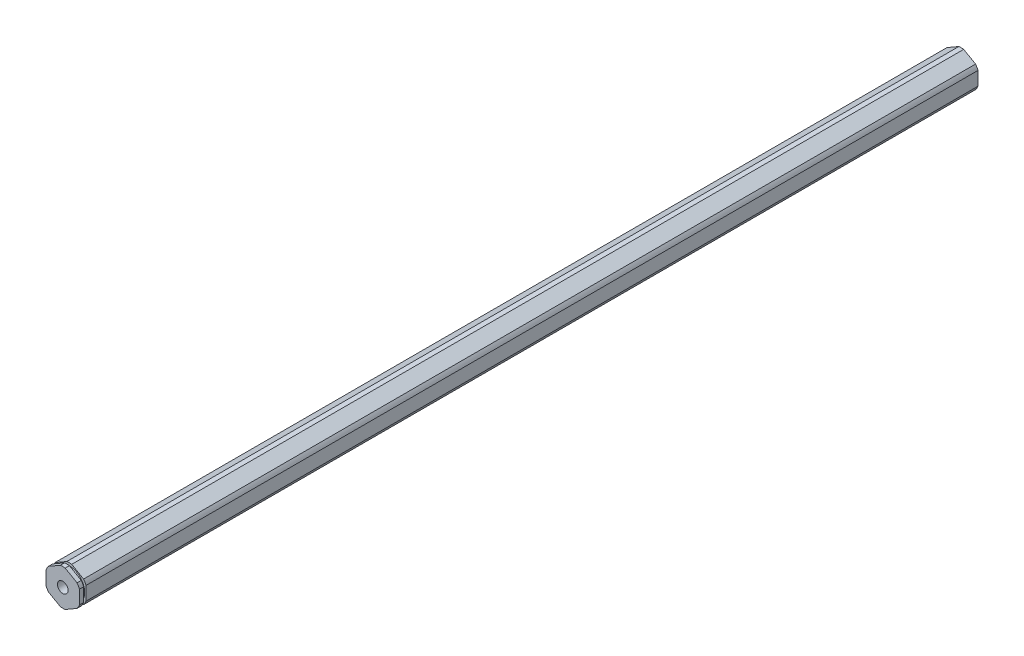
ISO-10303-21;
HEADER;
FILE_DESCRIPTION(('STEP AP214'),'2;1');
FILE_NAME('part.step','',(''),(''),'','','');
FILE_SCHEMA(('AUTOMOTIVE_DESIGN { 1 0 10303 214 1 1 1 1 }'));
ENDSEC;
DATA;
#1=APPLICATION_CONTEXT('core data for automotive mechanical design processes');
#2=APPLICATION_PROTOCOL_DEFINITION('international standard','automotive_design',2000,#1);
#3=PRODUCT_CONTEXT('',#1,'mechanical');
#4=PRODUCT('Part','Part','',(#3));
#5=PRODUCT_RELATED_PRODUCT_CATEGORY('part','',(#4));
#6=PRODUCT_DEFINITION_FORMATION('','',#4);
#7=PRODUCT_DEFINITION_CONTEXT('part definition',#1,'design');
#8=PRODUCT_DEFINITION('design','',#6,#7);
#9=PRODUCT_DEFINITION_SHAPE('','',#8);
#10=(LENGTH_UNIT() NAMED_UNIT(*) SI_UNIT(.MILLI.,.METRE.));
#11=(NAMED_UNIT(*) PLANE_ANGLE_UNIT() SI_UNIT($,.RADIAN.));
#12=(NAMED_UNIT(*) SI_UNIT($,.STERADIAN.) SOLID_ANGLE_UNIT());
#13=UNCERTAINTY_MEASURE_WITH_UNIT(LENGTH_MEASURE(1.E-05),#10,'distance_accuracy_value','');
#14=(GEOMETRIC_REPRESENTATION_CONTEXT(3) GLOBAL_UNCERTAINTY_ASSIGNED_CONTEXT((#13)) GLOBAL_UNIT_ASSIGNED_CONTEXT((#10,
#11,#12)) REPRESENTATION_CONTEXT('',''));
#15=CARTESIAN_POINT('',(0.,0.,0.));
#16=DIRECTION('',(0.,0.,1.));
#17=DIRECTION('',(1.,0.,0.));
#18=AXIS2_PLACEMENT_3D('',#15,#16,#17);
#19=CARTESIAN_POINT('',(6.35,0.,170.307));
#20=DIRECTION('',(-1.,0.,0.));
#21=DIRECTION('',(0.,-1.,0.));
#22=AXIS2_PLACEMENT_3D('',#19,#20,#21);
#23=PLANE('',#22);
#24=DIRECTION('',(0.,-1.,0.));
#25=VECTOR('',#24,1.);
#26=CARTESIAN_POINT('',(6.35,0.,168.7195));
#27=LINE('',#26,#25);
#28=CARTESIAN_POINT('',(6.35,2.59030191290513,168.7195));
#29=VERTEX_POINT('',#28);
#30=CARTESIAN_POINT('',(6.35,-2.59030191290513,168.7195));
#31=VERTEX_POINT('',#30);
#32=EDGE_CURVE('E80',#29,#31,#27,.T.);
#33=ORIENTED_EDGE('',*,*,#32,.F.);
#34=DIRECTION('',(0.,0.,-1.));
#35=VECTOR('',#34,1.);
#36=CARTESIAN_POINT('',(6.35,2.59030191290513,170.307));
#37=LINE('',#36,#35);
#38=CARTESIAN_POINT('',(6.35,2.59030191290513,170.307));
#39=VERTEX_POINT('',#38);
#40=EDGE_CURVE('E251',#39,#29,#37,.T.);
#41=ORIENTED_EDGE('',*,*,#40,.F.);
#42=DIRECTION('',(0.,1.,0.));
#43=VECTOR('',#42,1.);
#44=CARTESIAN_POINT('',(6.35,0.,170.307));
#45=LINE('',#44,#43);
#46=CARTESIAN_POINT('',(6.35,-2.59030191290513,170.307));
#47=VERTEX_POINT('',#46);
#48=EDGE_CURVE('E365',#47,#39,#45,.T.);
#49=ORIENTED_EDGE('',*,*,#48,.F.);
#50=DIRECTION('',(0.,0.,-1.));
#51=VECTOR('',#50,1.);
#52=CARTESIAN_POINT('',(6.35,-2.59030191290513,170.307));
#53=LINE('',#52,#51);
#54=EDGE_CURVE('E306',#47,#31,#53,.T.);
#55=ORIENTED_EDGE('',*,*,#54,.T.);
#56=EDGE_LOOP('',(#33,#41,#49,#55));
#57=FACE_BOUND('',#56,.T.);
#58=ADVANCED_FACE('F58',(#57),#23,.F.);
#59=CARTESIAN_POINT('',(0.,0.,170.307));
#60=DIRECTION('',(0.,0.,-1.));
#61=DIRECTION('',(-1.,0.,0.));
#62=AXIS2_PLACEMENT_3D('',#59,#60,#61);
#63=CYLINDRICAL_SURFACE('',#62,6.858);
#64=CARTESIAN_POINT('',(0.,0.,168.7195));
#65=DIRECTION('',(0.,0.,1.));
#66=DIRECTION('',(1.,0.,0.));
#67=AXIS2_PLACEMENT_3D('',#64,#65,#66);
#68=CIRCLE('',#67,6.858);
#69=CARTESIAN_POINT('',(5.41826726004727,4.20411035757862,168.7195));
#70=VERTEX_POINT('',#69);
#71=EDGE_CURVE('E420',#29,#70,#68,.T.);
#72=ORIENTED_EDGE('',*,*,#71,.T.);
#73=DIRECTION('',(0.,0.,-1.));
#74=VECTOR('',#73,1.);
#75=CARTESIAN_POINT('',(5.41826726004727,4.20411035757862,170.307));
#76=LINE('',#75,#74);
#77=CARTESIAN_POINT('',(5.41826726004727,4.20411035757862,170.307));
#78=VERTEX_POINT('',#77);
#79=EDGE_CURVE('E252',#78,#70,#76,.T.);
#80=ORIENTED_EDGE('',*,*,#79,.F.);
#81=CARTESIAN_POINT('',(0.,0.,170.307));
#82=DIRECTION('',(0.,0.,1.));
#83=DIRECTION('',(1.,0.,0.));
#84=AXIS2_PLACEMENT_3D('',#81,#82,#83);
#85=CIRCLE('',#84,6.858);
#86=EDGE_CURVE('E362',#39,#78,#85,.T.);
#87=ORIENTED_EDGE('',*,*,#86,.F.);
#88=ORIENTED_EDGE('',*,*,#40,.T.);
#89=EDGE_LOOP('',(#72,#80,#87,#88));
#90=FACE_BOUND('',#89,.T.);
#91=ADVANCED_FACE('F550',(#90),#63,.T.);
#92=CARTESIAN_POINT('',(3.175,5.49926131403119,170.307));
#93=DIRECTION('',(-0.5,-0.866025403784439,0.));
#94=DIRECTION('',(0.866025403784439,-0.5,0.));
#95=AXIS2_PLACEMENT_3D('',#92,#93,#94);
#96=PLANE('',#95);
#97=DIRECTION('',(0.866025403784439,-0.5,0.));
#98=VECTOR('',#97,1.);
#99=CARTESIAN_POINT('',(3.175,5.49926131403119,168.7195));
#100=LINE('',#99,#98);
#101=CARTESIAN_POINT('',(0.931732739952733,6.79441227048375,168.7195));
#102=VERTEX_POINT('',#101);
#103=EDGE_CURVE('E386',#102,#70,#100,.T.);
#104=ORIENTED_EDGE('',*,*,#103,.F.);
#105=DIRECTION('',(0.,0.,-1.));
#106=VECTOR('',#105,1.);
#107=CARTESIAN_POINT('',(0.931732739952733,6.79441227048375,170.307));
#108=LINE('',#107,#106);
#109=CARTESIAN_POINT('',(0.931732739952733,6.79441227048375,170.307));
#110=VERTEX_POINT('',#109);
#111=EDGE_CURVE('E261',#110,#102,#108,.T.);
#112=ORIENTED_EDGE('',*,*,#111,.F.);
#113=DIRECTION('',(-0.866025403784439,0.5,0.));
#114=VECTOR('',#113,1.);
#115=CARTESIAN_POINT('',(3.175,5.49926131403119,170.307));
#116=LINE('',#115,#114);
#117=EDGE_CURVE('E359',#78,#110,#116,.T.);
#118=ORIENTED_EDGE('',*,*,#117,.F.);
#119=ORIENTED_EDGE('',*,*,#79,.T.);
#120=EDGE_LOOP('',(#104,#112,#118,#119));
#121=FACE_BOUND('',#120,.T.);
#122=ADVANCED_FACE('F562',(#121),#96,.F.);
#123=CARTESIAN_POINT('',(-0.931732739952722,6.79441227048375,168.7195));
#124=VERTEX_POINT('',#123);
#125=EDGE_CURVE('E423',#102,#124,#68,.T.);
#126=ORIENTED_EDGE('',*,*,#125,.T.);
#127=DIRECTION('',(0.,0.,-1.));
#128=VECTOR('',#127,1.);
#129=CARTESIAN_POINT('',(-0.931732739952731,6.79441227048375,170.307));
#130=LINE('',#129,#128);
#131=CARTESIAN_POINT('',(-0.931732739952731,6.79441227048375,170.307));
#132=VERTEX_POINT('',#131);
#133=EDGE_CURVE('E266',#132,#124,#130,.T.);
#134=ORIENTED_EDGE('',*,*,#133,.F.);
#135=EDGE_CURVE('E358',#110,#132,#85,.T.);
#136=ORIENTED_EDGE('',*,*,#135,.F.);
#137=ORIENTED_EDGE('',*,*,#111,.T.);
#138=EDGE_LOOP('',(#126,#134,#136,#137));
#139=FACE_BOUND('',#138,.T.);
#140=ADVANCED_FACE('F567',(#139),#63,.T.);
#141=CARTESIAN_POINT('',(-3.175,5.49926131403119,170.307));
#142=DIRECTION('',(0.5,-0.866025403784438,0.));
#143=DIRECTION('',(0.866025403784439,0.5,0.));
#144=AXIS2_PLACEMENT_3D('',#141,#142,#143);
#145=PLANE('',#144);
#146=DIRECTION('',(0.866025403784439,0.5,0.));
#147=VECTOR('',#146,1.);
#148=CARTESIAN_POINT('',(-3.175,5.49926131403119,168.7195));
#149=LINE('',#148,#147);
#150=CARTESIAN_POINT('',(-5.41826726004727,4.20411035757862,168.7195));
#151=VERTEX_POINT('',#150);
#152=EDGE_CURVE('E389',#151,#124,#149,.T.);
#153=ORIENTED_EDGE('',*,*,#152,.F.);
#154=DIRECTION('',(0.,0.,-1.));
#155=VECTOR('',#154,1.);
#156=CARTESIAN_POINT('',(-5.41826726004727,4.20411035757862,170.307));
#157=LINE('',#156,#155);
#158=CARTESIAN_POINT('',(-5.41826726004727,4.20411035757862,170.307));
#159=VERTEX_POINT('',#158);
#160=EDGE_CURVE('E271',#159,#151,#157,.T.);
#161=ORIENTED_EDGE('',*,*,#160,.F.);
#162=DIRECTION('',(-0.866025403784439,-0.5,0.));
#163=VECTOR('',#162,1.);
#164=CARTESIAN_POINT('',(-3.175,5.49926131403119,170.307));
#165=LINE('',#164,#163);
#166=EDGE_CURVE('E355',#132,#159,#165,.T.);
#167=ORIENTED_EDGE('',*,*,#166,.F.);
#168=ORIENTED_EDGE('',*,*,#133,.T.);
#169=EDGE_LOOP('',(#153,#161,#167,#168));
#170=FACE_BOUND('',#169,.T.);
#171=ADVANCED_FACE('F572',(#170),#145,.F.);
#172=CARTESIAN_POINT('',(-6.35,2.59030191290514,168.7195));
#173=VERTEX_POINT('',#172);
#174=EDGE_CURVE('E431',#151,#173,#68,.T.);
#175=ORIENTED_EDGE('',*,*,#174,.T.);
#176=DIRECTION('',(0.,0.,-1.));
#177=VECTOR('',#176,1.);
#178=CARTESIAN_POINT('',(-6.35,2.59030191290514,170.307));
#179=LINE('',#178,#177);
#180=CARTESIAN_POINT('',(-6.35,2.59030191290514,170.307));
#181=VERTEX_POINT('',#180);
#182=EDGE_CURVE('E276',#181,#173,#179,.T.);
#183=ORIENTED_EDGE('',*,*,#182,.F.);
#184=EDGE_CURVE('E354',#159,#181,#85,.T.);
#185=ORIENTED_EDGE('',*,*,#184,.F.);
#186=ORIENTED_EDGE('',*,*,#160,.T.);
#187=EDGE_LOOP('',(#175,#183,#185,#186));
#188=FACE_BOUND('',#187,.T.);
#189=ADVANCED_FACE('F445',(#188),#63,.T.);
#190=CARTESIAN_POINT('',(-6.35,0.,170.307));
#191=DIRECTION('',(1.,0.,0.));
#192=DIRECTION('',(0.,1.,0.));
#193=AXIS2_PLACEMENT_3D('',#190,#191,#192);
#194=PLANE('',#193);
#195=DIRECTION('',(0.,1.,0.));
#196=VECTOR('',#195,1.);
#197=CARTESIAN_POINT('',(-6.35,0.,168.7195));
#198=LINE('',#197,#196);
#199=CARTESIAN_POINT('',(-6.35,-2.59030191290514,168.7195));
#200=VERTEX_POINT('',#199);
#201=EDGE_CURVE('E392',#200,#173,#198,.T.);
#202=ORIENTED_EDGE('',*,*,#201,.F.);
#203=DIRECTION('',(0.,0.,-1.));
#204=VECTOR('',#203,1.);
#205=CARTESIAN_POINT('',(-6.35,-2.59030191290514,170.307));
#206=LINE('',#205,#204);
#207=CARTESIAN_POINT('',(-6.35,-2.59030191290514,170.307));
#208=VERTEX_POINT('',#207);
#209=EDGE_CURVE('E281',#208,#200,#206,.T.);
#210=ORIENTED_EDGE('',*,*,#209,.F.);
#211=DIRECTION('',(0.,-1.,0.));
#212=VECTOR('',#211,1.);
#213=CARTESIAN_POINT('',(-6.35,0.,170.307));
#214=LINE('',#213,#212);
#215=EDGE_CURVE('E351',#181,#208,#214,.T.);
#216=ORIENTED_EDGE('',*,*,#215,.F.);
#217=ORIENTED_EDGE('',*,*,#182,.T.);
#218=EDGE_LOOP('',(#202,#210,#216,#217));
#219=FACE_BOUND('',#218,.T.);
#220=ADVANCED_FACE('F452',(#219),#194,.F.);
#221=CARTESIAN_POINT('',(-5.41826726004727,-4.20411035757862,168.7195));
#222=VERTEX_POINT('',#221);
#223=EDGE_CURVE('E434',#200,#222,#68,.T.);
#224=ORIENTED_EDGE('',*,*,#223,.T.);
#225=DIRECTION('',(0.,0.,-1.));
#226=VECTOR('',#225,1.);
#227=CARTESIAN_POINT('',(-5.41826726004728,-4.20411035757862,170.307));
#228=LINE('',#227,#226);
#229=CARTESIAN_POINT('',(-5.41826726004728,-4.20411035757862,170.307));
#230=VERTEX_POINT('',#229);
#231=EDGE_CURVE('E286',#230,#222,#228,.T.);
#232=ORIENTED_EDGE('',*,*,#231,.F.);
#233=EDGE_CURVE('E350',#208,#230,#85,.T.);
#234=ORIENTED_EDGE('',*,*,#233,.F.);
#235=ORIENTED_EDGE('',*,*,#209,.T.);
#236=EDGE_LOOP('',(#224,#232,#234,#235));
#237=FACE_BOUND('',#236,.T.);
#238=ADVANCED_FACE('F541',(#237),#63,.T.);
#239=CARTESIAN_POINT('',(-3.175,-5.49926131403118,170.307));
#240=DIRECTION('',(0.5,0.866025403784439,0.));
#241=DIRECTION('',(-0.866025403784439,0.5,0.));
#242=AXIS2_PLACEMENT_3D('',#239,#240,#241);
#243=PLANE('',#242);
#244=DIRECTION('',(-0.866025403784439,0.5,0.));
#245=VECTOR('',#244,1.);
#246=CARTESIAN_POINT('',(-3.175,-5.49926131403118,168.7195));
#247=LINE('',#246,#245);
#248=CARTESIAN_POINT('',(-0.931732739952721,-6.79441227048375,168.7195));
#249=VERTEX_POINT('',#248);
#250=EDGE_CURVE('E395',#249,#222,#247,.T.);
#251=ORIENTED_EDGE('',*,*,#250,.F.);
#252=DIRECTION('',(0.,0.,-1.));
#253=VECTOR('',#252,1.);
#254=CARTESIAN_POINT('',(-0.931732739952721,-6.79441227048375,170.307));
#255=LINE('',#254,#253);
#256=CARTESIAN_POINT('',(-0.931732739952721,-6.79441227048375,170.307));
#257=VERTEX_POINT('',#256);
#258=EDGE_CURVE('E291',#257,#249,#255,.T.);
#259=ORIENTED_EDGE('',*,*,#258,.F.);
#260=DIRECTION('',(0.866025403784439,-0.5,0.));
#261=VECTOR('',#260,1.);
#262=CARTESIAN_POINT('',(-3.175,-5.49926131403118,170.307));
#263=LINE('',#262,#261);
#264=EDGE_CURVE('E347',#230,#257,#263,.T.);
#265=ORIENTED_EDGE('',*,*,#264,.F.);
#266=ORIENTED_EDGE('',*,*,#231,.T.);
#267=EDGE_LOOP('',(#251,#259,#265,#266));
#268=FACE_BOUND('',#267,.T.);
#269=ADVANCED_FACE('F549',(#268),#243,.F.);
#270=CARTESIAN_POINT('',(0.931732739952722,-6.79441227048375,168.7195));
#271=VERTEX_POINT('',#270);
#272=EDGE_CURVE('E424',#249,#271,#68,.T.);
#273=ORIENTED_EDGE('',*,*,#272,.T.);
#274=DIRECTION('',(0.,0.,-1.));
#275=VECTOR('',#274,1.);
#276=CARTESIAN_POINT('',(0.931732739952731,-6.79441227048375,170.307));
#277=LINE('',#276,#275);
#278=CARTESIAN_POINT('',(0.931732739952731,-6.79441227048375,170.307));
#279=VERTEX_POINT('',#278);
#280=EDGE_CURVE('E296',#279,#271,#277,.T.);
#281=ORIENTED_EDGE('',*,*,#280,.F.);
#282=EDGE_CURVE('E346',#257,#279,#85,.T.);
#283=ORIENTED_EDGE('',*,*,#282,.F.);
#284=ORIENTED_EDGE('',*,*,#258,.T.);
#285=EDGE_LOOP('',(#273,#281,#283,#284));
#286=FACE_BOUND('',#285,.T.);
#287=ADVANCED_FACE('F540',(#286),#63,.T.);
#288=CARTESIAN_POINT('',(3.175,-5.49926131403118,170.307));
#289=DIRECTION('',(-0.5,0.866025403784438,0.));
#290=DIRECTION('',(-0.866025403784439,-0.5,0.));
#291=AXIS2_PLACEMENT_3D('',#288,#289,#290);
#292=PLANE('',#291);
#293=DIRECTION('',(-0.866025403784439,-0.5,0.));
#294=VECTOR('',#293,1.);
#295=CARTESIAN_POINT('',(3.175,-5.49926131403118,168.7195));
#296=LINE('',#295,#294);
#297=CARTESIAN_POINT('',(5.41826726004727,-4.20411035757862,168.7195));
#298=VERTEX_POINT('',#297);
#299=EDGE_CURVE('E231',#298,#271,#296,.T.);
#300=ORIENTED_EDGE('',*,*,#299,.F.);
#301=DIRECTION('',(0.,0.,-1.));
#302=VECTOR('',#301,1.);
#303=CARTESIAN_POINT('',(5.41826726004727,-4.20411035757862,170.307));
#304=LINE('',#303,#302);
#305=CARTESIAN_POINT('',(5.41826726004727,-4.20411035757862,170.307));
#306=VERTEX_POINT('',#305);
#307=EDGE_CURVE('E301',#306,#298,#304,.T.);
#308=ORIENTED_EDGE('',*,*,#307,.F.);
#309=DIRECTION('',(0.866025403784439,0.5,0.));
#310=VECTOR('',#309,1.);
#311=CARTESIAN_POINT('',(3.175,-5.49926131403118,170.307));
#312=LINE('',#311,#310);
#313=EDGE_CURVE('E342',#279,#306,#312,.T.);
#314=ORIENTED_EDGE('',*,*,#313,.F.);
#315=ORIENTED_EDGE('',*,*,#280,.T.);
#316=EDGE_LOOP('',(#300,#308,#314,#315));
#317=FACE_BOUND('',#316,.T.);
#318=ADVANCED_FACE('F554',(#317),#292,.F.);
#319=CARTESIAN_POINT('',(0.,0.,168.7195));
#320=DIRECTION('',(0.,0.,-1.));
#321=DIRECTION('',(-1.,0.,0.));
#322=AXIS2_PLACEMENT_3D('',#319,#320,#321);
#323=CIRCLE('',#322,6.858);
#324=EDGE_CURVE('E11',#31,#298,#323,.T.);
#325=ORIENTED_EDGE('',*,*,#324,.F.);
#326=ORIENTED_EDGE('',*,*,#54,.F.);
#327=EDGE_CURVE('E345',#306,#47,#85,.T.);
#328=ORIENTED_EDGE('',*,*,#327,.F.);
#329=ORIENTED_EDGE('',*,*,#307,.T.);
#330=EDGE_LOOP('',(#325,#326,#328,#329));
#331=FACE_BOUND('',#330,.T.);
#332=ADVANCED_FACE('F683',(#331),#63,.T.);
#333=CARTESIAN_POINT('',(0.,0.,170.307));
#334=DIRECTION('',(0.,0.,1.));
#335=DIRECTION('',(1.,0.,0.));
#336=AXIS2_PLACEMENT_3D('',#333,#334,#335);
#337=PLANE('',#336);
#338=CARTESIAN_POINT('',(0.,0.,170.307));
#339=DIRECTION('',(0.,0.,1.));
#340=DIRECTION('',(1.,0.,0.));
#341=AXIS2_PLACEMENT_3D('',#338,#339,#340);
#342=CIRCLE('',#341,2.01929999999999);
#343=CARTESIAN_POINT('',(2.01929999999999,0.,170.307));
#344=VERTEX_POINT('',#343);
#345=EDGE_CURVE('E380',#344,#344,#342,.T.);
#346=ORIENTED_EDGE('',*,*,#345,.F.);
#347=EDGE_LOOP('',(#346));
#348=FACE_BOUND('',#347,.T.);
#349=ORIENTED_EDGE('',*,*,#48,.T.);
#350=ORIENTED_EDGE('',*,*,#86,.T.);
#351=ORIENTED_EDGE('',*,*,#117,.T.);
#352=ORIENTED_EDGE('',*,*,#135,.T.);
#353=ORIENTED_EDGE('',*,*,#166,.T.);
#354=ORIENTED_EDGE('',*,*,#184,.T.);
#355=ORIENTED_EDGE('',*,*,#215,.T.);
#356=ORIENTED_EDGE('',*,*,#233,.T.);
#357=ORIENTED_EDGE('',*,*,#264,.T.);
#358=ORIENTED_EDGE('',*,*,#282,.T.);
#359=ORIENTED_EDGE('',*,*,#313,.T.);
#360=ORIENTED_EDGE('',*,*,#327,.T.);
#361=EDGE_LOOP('',(#349,#350,#351,#352,#353,#354,#355,#356,#357,#358,#359,#360));
#362=FACE_BOUND('',#361,.T.);
#363=ADVANCED_FACE('F456',(#348,#362),#337,.T.);
#364=CARTESIAN_POINT('',(0.,0.,153.95956));
#365=DIRECTION('',(0.,0.,1.));
#366=DIRECTION('',(1.,0.,0.));
#367=AXIS2_PLACEMENT_3D('',#364,#365,#366);
#368=CONICAL_SURFACE('',#367,2.01929999999999,1.02974425867665);
#369=CARTESIAN_POINT('',(0.,0.,152.746242151998));
#370=VERTEX_POINT('',#369);
#371=VERTEX_LOOP('',#370);
#372=FACE_BOUND('',#371,.T.);
#373=CARTESIAN_POINT('',(0.,0.,153.95956));
#374=DIRECTION('',(0.,0.,1.));
#375=DIRECTION('',(1.,0.,0.));
#376=AXIS2_PLACEMENT_3D('',#373,#374,#375);
#377=CIRCLE('',#376,2.01929999999999);
#378=CARTESIAN_POINT('',(2.01929999999999,0.,153.95956));
#379=VERTEX_POINT('',#378);
#380=EDGE_CURVE('E376',#379,#379,#377,.T.);
#381=ORIENTED_EDGE('',*,*,#380,.T.);
#382=EDGE_LOOP('',(#381));
#383=FACE_BOUND('',#382,.T.);
#384=ADVANCED_FACE('F767',(#372,#383),#368,.F.);
#385=CARTESIAN_POINT('',(0.,0.,170.307));
#386=DIRECTION('',(0.,0.,1.));
#387=DIRECTION('',(1.,0.,0.));
#388=AXIS2_PLACEMENT_3D('',#385,#386,#387);
#389=CYLINDRICAL_SURFACE('',#388,2.01929999999999);
#390=ORIENTED_EDGE('',*,*,#380,.F.);
#391=EDGE_LOOP('',(#390));
#392=FACE_BOUND('',#391,.T.);
#393=ORIENTED_EDGE('',*,*,#345,.T.);
#394=EDGE_LOOP('',(#393));
#395=FACE_BOUND('',#394,.T.);
#396=ADVANCED_FACE('F655',(#392,#395),#389,.F.);
#397=CARTESIAN_POINT('',(0.,6.858,168.7195));
#398=DIRECTION('',(0.,0.,-1.));
#399=DIRECTION('',(-1.,0.,0.));
#400=AXIS2_PLACEMENT_3D('',#397,#398,#399);
#401=PLANE('',#400);
#402=CARTESIAN_POINT('',(0.,0.,168.7195));
#403=DIRECTION('',(0.,0.,1.));
#404=DIRECTION('',(1.,0.,0.));
#405=AXIS2_PLACEMENT_3D('',#402,#403,#404);
#406=CIRCLE('',#405,5.8547);
#407=CARTESIAN_POINT('',(5.8547,0.,168.7195));
#408=VERTEX_POINT('',#407);
#409=EDGE_CURVE('E413',#408,#408,#406,.T.);
#410=ORIENTED_EDGE('',*,*,#409,.T.);
#411=EDGE_LOOP('',(#410));
#412=FACE_BOUND('',#411,.T.);
#413=ORIENTED_EDGE('',*,*,#32,.T.);
#414=ORIENTED_EDGE('',*,*,#324,.T.);
#415=ORIENTED_EDGE('',*,*,#299,.T.);
#416=ORIENTED_EDGE('',*,*,#272,.F.);
#417=ORIENTED_EDGE('',*,*,#250,.T.);
#418=ORIENTED_EDGE('',*,*,#223,.F.);
#419=ORIENTED_EDGE('',*,*,#201,.T.);
#420=ORIENTED_EDGE('',*,*,#174,.F.);
#421=ORIENTED_EDGE('',*,*,#152,.T.);
#422=ORIENTED_EDGE('',*,*,#125,.F.);
#423=ORIENTED_EDGE('',*,*,#103,.T.);
#424=ORIENTED_EDGE('',*,*,#71,.F.);
#425=EDGE_LOOP('',(#413,#414,#415,#416,#417,#418,#419,#420,#421,#422,#423,#424));
#426=FACE_BOUND('',#425,.T.);
#427=ADVANCED_FACE('F651',(#412,#426),#401,.T.);
#428=CARTESIAN_POINT('',(0.,6.858,167.8305));
#429=DIRECTION('',(0.,0.,1.));
#430=DIRECTION('',(1.,0.,0.));
#431=AXIS2_PLACEMENT_3D('',#428,#429,#430);
#432=PLANE('',#431);
#433=CARTESIAN_POINT('',(0.,0.,167.8305));
#434=DIRECTION('',(0.,0.,1.));
#435=DIRECTION('',(1.,0.,0.));
#436=AXIS2_PLACEMENT_3D('',#433,#434,#435);
#437=CIRCLE('',#436,5.8547);
#438=CARTESIAN_POINT('',(5.8547,0.,167.8305));
#439=VERTEX_POINT('',#438);
#440=EDGE_CURVE('E242',#439,#439,#437,.T.);
#441=ORIENTED_EDGE('',*,*,#440,.F.);
#442=EDGE_LOOP('',(#441));
#443=FACE_BOUND('',#442,.T.);
#444=DIRECTION('',(0.,1.,0.));
#445=VECTOR('',#444,1.);
#446=CARTESIAN_POINT('',(6.35,0.,167.8305));
#447=LINE('',#446,#445);
#448=CARTESIAN_POINT('',(6.35,-2.59030191290513,167.8305));
#449=VERTEX_POINT('',#448);
#450=CARTESIAN_POINT('',(6.35,2.59030191290513,167.8305));
#451=VERTEX_POINT('',#450);
#452=EDGE_CURVE('E222',#449,#451,#447,.T.);
#453=ORIENTED_EDGE('',*,*,#452,.T.);
#454=CARTESIAN_POINT('',(0.,0.,167.8305));
#455=DIRECTION('',(0.,0.,1.));
#456=DIRECTION('',(1.,0.,0.));
#457=AXIS2_PLACEMENT_3D('',#454,#455,#456);
#458=CIRCLE('',#457,6.858);
#459=CARTESIAN_POINT('',(5.41826726004727,4.20411035757862,167.8305));
#460=VERTEX_POINT('',#459);
#461=EDGE_CURVE('E225',#451,#460,#458,.T.);
#462=ORIENTED_EDGE('',*,*,#461,.T.);
#463=DIRECTION('',(-0.866025403784439,0.5,0.));
#464=VECTOR('',#463,1.);
#465=CARTESIAN_POINT('',(3.175,5.49926131403119,167.8305));
#466=LINE('',#465,#464);
#467=CARTESIAN_POINT('',(0.931732739952733,6.79441227048375,167.8305));
#468=VERTEX_POINT('',#467);
#469=EDGE_CURVE('E232',#460,#468,#466,.T.);
#470=ORIENTED_EDGE('',*,*,#469,.T.);
#471=CARTESIAN_POINT('',(-0.931732739952722,6.79441227048375,167.8305));
#472=VERTEX_POINT('',#471);
#473=EDGE_CURVE('E243',#468,#472,#458,.T.);
#474=ORIENTED_EDGE('',*,*,#473,.T.);
#475=DIRECTION('',(-0.866025403784439,-0.5,0.));
#476=VECTOR('',#475,1.);
#477=CARTESIAN_POINT('',(-3.175,5.49926131403119,167.8305));
#478=LINE('',#477,#476);
#479=CARTESIAN_POINT('',(-5.41826726004727,4.20411035757862,167.8305));
#480=VERTEX_POINT('',#479);
#481=EDGE_CURVE('E402',#472,#480,#478,.T.);
#482=ORIENTED_EDGE('',*,*,#481,.T.);
#483=CARTESIAN_POINT('',(-6.35,2.59030191290514,167.8305));
#484=VERTEX_POINT('',#483);
#485=EDGE_CURVE('E525',#480,#484,#458,.T.);
#486=ORIENTED_EDGE('',*,*,#485,.T.);
#487=DIRECTION('',(0.,-1.,0.));
#488=VECTOR('',#487,1.);
#489=CARTESIAN_POINT('',(-6.35,0.,167.8305));
#490=LINE('',#489,#488);
#491=CARTESIAN_POINT('',(-6.35,-2.59030191290514,167.8305));
#492=VERTEX_POINT('',#491);
#493=EDGE_CURVE('E405',#484,#492,#490,.T.);
#494=ORIENTED_EDGE('',*,*,#493,.T.);
#495=CARTESIAN_POINT('',(-5.41826726004727,-4.20411035757862,167.8305));
#496=VERTEX_POINT('',#495);
#497=EDGE_CURVE('E429',#492,#496,#458,.T.);
#498=ORIENTED_EDGE('',*,*,#497,.T.);
#499=DIRECTION('',(0.866025403784439,-0.5,0.));
#500=VECTOR('',#499,1.);
#501=CARTESIAN_POINT('',(-3.175,-5.49926131403118,167.8305));
#502=LINE('',#501,#500);
#503=CARTESIAN_POINT('',(-0.931732739952721,-6.79441227048375,167.8305));
#504=VERTEX_POINT('',#503);
#505=EDGE_CURVE('E408',#496,#504,#502,.T.);
#506=ORIENTED_EDGE('',*,*,#505,.T.);
#507=CARTESIAN_POINT('',(0.931732739952722,-6.79441227048375,167.8305));
#508=VERTEX_POINT('',#507);
#509=EDGE_CURVE('E245',#504,#508,#458,.T.);
#510=ORIENTED_EDGE('',*,*,#509,.T.);
#511=DIRECTION('',(0.866025403784439,0.5,0.));
#512=VECTOR('',#511,1.);
#513=CARTESIAN_POINT('',(3.175,-5.49926131403118,167.8305));
#514=LINE('',#513,#512);
#515=CARTESIAN_POINT('',(5.41826726004727,-4.20411035757862,167.8305));
#516=VERTEX_POINT('',#515);
#517=EDGE_CURVE('E73',#508,#516,#514,.T.);
#518=ORIENTED_EDGE('',*,*,#517,.T.);
#519=CARTESIAN_POINT('',(0.,0.,167.8305));
#520=DIRECTION('',(0.,0.,1.));
#521=DIRECTION('',(1.,0.,0.));
#522=AXIS2_PLACEMENT_3D('',#519,#520,#521);
#523=CIRCLE('',#522,6.858);
#524=EDGE_CURVE('E66',#516,#449,#523,.T.);
#525=ORIENTED_EDGE('',*,*,#524,.T.);
#526=EDGE_LOOP('',(#453,#462,#470,#474,#482,#486,#494,#498,#506,#510,#518,#525));
#527=FACE_BOUND('',#526,.T.);
#528=ADVANCED_FACE('F224',(#443,#527),#432,.T.);
#529=CARTESIAN_POINT('',(0.,0.,165.047176272324));
#530=DIRECTION('',(0.,0.,1.));
#531=DIRECTION('',(1.,0.,0.));
#532=AXIS2_PLACEMENT_3D('',#529,#530,#531);
#533=CYLINDRICAL_SURFACE('',#532,5.8547);
#534=ORIENTED_EDGE('',*,*,#440,.T.);
#535=EDGE_LOOP('',(#534));
#536=FACE_BOUND('',#535,.T.);
#537=ORIENTED_EDGE('',*,*,#409,.F.);
#538=EDGE_LOOP('',(#537));
#539=FACE_BOUND('',#538,.T.);
#540=ADVANCED_FACE('F664',(#536,#539),#533,.T.);
#541=CARTESIAN_POINT('',(0.,0.,-153.95956));
#542=DIRECTION('',(0.,0.,-1.));
#543=DIRECTION('',(-1.,0.,0.));
#544=AXIS2_PLACEMENT_3D('',#541,#542,#543);
#545=CONICAL_SURFACE('',#544,2.01929999999999,1.02974425867665);
#546=CARTESIAN_POINT('',(0.,0.,-152.746242151998));
#547=VERTEX_POINT('',#546);
#548=VERTEX_LOOP('',#547);
#549=FACE_BOUND('',#548,.T.);
#550=CARTESIAN_POINT('',(0.,0.,-153.95956));
#551=DIRECTION('',(0.,0.,-1.));
#552=DIRECTION('',(-1.,0.,0.));
#553=AXIS2_PLACEMENT_3D('',#550,#551,#552);
#554=CIRCLE('',#553,2.01929999999999);
#555=CARTESIAN_POINT('',(-2.01929999999999,0.,-153.95956));
#556=VERTEX_POINT('',#555);
#557=EDGE_CURVE('E341',#556,#556,#554,.T.);
#558=ORIENTED_EDGE('',*,*,#557,.T.);
#559=EDGE_LOOP('',(#558));
#560=FACE_BOUND('',#559,.T.);
#561=ADVANCED_FACE('F672',(#549,#560),#545,.F.);
#562=CARTESIAN_POINT('',(0.,0.,-170.307));
#563=DIRECTION('',(0.,0.,-1.));
#564=DIRECTION('',(-1.,0.,0.));
#565=AXIS2_PLACEMENT_3D('',#562,#563,#564);
#566=CYLINDRICAL_SURFACE('',#565,2.01929999999999);
#567=ORIENTED_EDGE('',*,*,#557,.F.);
#568=EDGE_LOOP('',(#567));
#569=FACE_BOUND('',#568,.T.);
#570=CARTESIAN_POINT('',(0.,0.,-170.307));
#571=DIRECTION('',(0.,0.,-1.));
#572=DIRECTION('',(-1.,0.,0.));
#573=AXIS2_PLACEMENT_3D('',#570,#571,#572);
#574=CIRCLE('',#573,2.01929999999999);
#575=CARTESIAN_POINT('',(-2.01929999999999,0.,-170.307));
#576=VERTEX_POINT('',#575);
#577=EDGE_CURVE('E372',#576,#576,#574,.T.);
#578=ORIENTED_EDGE('',*,*,#577,.T.);
#579=EDGE_LOOP('',(#578));
#580=FACE_BOUND('',#579,.T.);
#581=ADVANCED_FACE('F784',(#569,#580),#566,.F.);
#582=CARTESIAN_POINT('',(0.,0.,-170.307));
#583=DIRECTION('',(0.,0.,1.));
#584=DIRECTION('',(1.,0.,0.));
#585=AXIS2_PLACEMENT_3D('',#582,#583,#584);
#586=PLANE('',#585);
#587=ORIENTED_EDGE('',*,*,#577,.F.);
#588=EDGE_LOOP('',(#587));
#589=FACE_BOUND('',#588,.T.);
#590=DIRECTION('',(0.,1.,0.));
#591=VECTOR('',#590,1.);
#592=CARTESIAN_POINT('',(6.35,0.,-170.307));
#593=LINE('',#592,#591);
#594=CARTESIAN_POINT('',(6.35,-2.59030191290513,-170.307));
#595=VERTEX_POINT('',#594);
#596=CARTESIAN_POINT('',(6.35,2.59030191290513,-170.307));
#597=VERTEX_POINT('',#596);
#598=EDGE_CURVE('E249',#595,#597,#593,.T.);
#599=ORIENTED_EDGE('',*,*,#598,.F.);
#600=CARTESIAN_POINT('',(0.,0.,-170.307));
#601=DIRECTION('',(0.,0.,1.));
#602=DIRECTION('',(1.,0.,0.));
#603=AXIS2_PLACEMENT_3D('',#600,#601,#602);
#604=CIRCLE('',#603,6.858);
#605=CARTESIAN_POINT('',(5.41826726004727,-4.20411035757862,-170.307));
#606=VERTEX_POINT('',#605);
#607=EDGE_CURVE('E315',#606,#595,#604,.T.);
#608=ORIENTED_EDGE('',*,*,#607,.F.);
#609=DIRECTION('',(0.866025403784439,0.5,0.));
#610=VECTOR('',#609,1.);
#611=CARTESIAN_POINT('',(3.175,-5.49926131403118,-170.307));
#612=LINE('',#611,#610);
#613=CARTESIAN_POINT('',(0.931732739952731,-6.79441227048375,-170.307));
#614=VERTEX_POINT('',#613);
#615=EDGE_CURVE('E311',#614,#606,#612,.T.);
#616=ORIENTED_EDGE('',*,*,#615,.F.);
#617=CARTESIAN_POINT('',(-0.931732739952721,-6.79441227048375,-170.307));
#618=VERTEX_POINT('',#617);
#619=EDGE_CURVE('E316',#618,#614,#604,.T.);
#620=ORIENTED_EDGE('',*,*,#619,.F.);
#621=DIRECTION('',(0.866025403784439,-0.5,0.));
#622=VECTOR('',#621,1.);
#623=CARTESIAN_POINT('',(-3.175,-5.49926131403118,-170.307));
#624=LINE('',#623,#622);
#625=CARTESIAN_POINT('',(-5.41826726004728,-4.20411035757862,-170.307));
#626=VERTEX_POINT('',#625);
#627=EDGE_CURVE('E317',#626,#618,#624,.T.);
#628=ORIENTED_EDGE('',*,*,#627,.F.);
#629=CARTESIAN_POINT('',(-6.35,-2.59030191290514,-170.307));
#630=VERTEX_POINT('',#629);
#631=EDGE_CURVE('E321',#630,#626,#604,.T.);
#632=ORIENTED_EDGE('',*,*,#631,.F.);
#633=DIRECTION('',(0.,-1.,0.));
#634=VECTOR('',#633,1.);
#635=CARTESIAN_POINT('',(-6.35,0.,-170.307));
#636=LINE('',#635,#634);
#637=CARTESIAN_POINT('',(-6.35,2.59030191290514,-170.307));
#638=VERTEX_POINT('',#637);
#639=EDGE_CURVE('E322',#638,#630,#636,.T.);
#640=ORIENTED_EDGE('',*,*,#639,.F.);
#641=CARTESIAN_POINT('',(-5.41826726004727,4.20411035757862,-170.307));
#642=VERTEX_POINT('',#641);
#643=EDGE_CURVE('E326',#642,#638,#604,.T.);
#644=ORIENTED_EDGE('',*,*,#643,.F.);
#645=DIRECTION('',(-0.866025403784439,-0.5,0.));
#646=VECTOR('',#645,1.);
#647=CARTESIAN_POINT('',(-3.175,5.49926131403119,-170.307));
#648=LINE('',#647,#646);
#649=CARTESIAN_POINT('',(-0.931732739952731,6.79441227048375,-170.307));
#650=VERTEX_POINT('',#649);
#651=EDGE_CURVE('E327',#650,#642,#648,.T.);
#652=ORIENTED_EDGE('',*,*,#651,.F.);
#653=CARTESIAN_POINT('',(0.931732739952733,6.79441227048375,-170.307));
#654=VERTEX_POINT('',#653);
#655=EDGE_CURVE('E331',#654,#650,#604,.T.);
#656=ORIENTED_EDGE('',*,*,#655,.F.);
#657=DIRECTION('',(-0.866025403784439,0.5,0.));
#658=VECTOR('',#657,1.);
#659=CARTESIAN_POINT('',(3.175,5.49926131403119,-170.307));
#660=LINE('',#659,#658);
#661=CARTESIAN_POINT('',(5.41826726004727,4.20411035757862,-170.307));
#662=VERTEX_POINT('',#661);
#663=EDGE_CURVE('E332',#662,#654,#660,.T.);
#664=ORIENTED_EDGE('',*,*,#663,.F.);
#665=EDGE_CURVE('E336',#597,#662,#604,.T.);
#666=ORIENTED_EDGE('',*,*,#665,.F.);
#667=EDGE_LOOP('',(#599,#608,#616,#620,#628,#632,#640,#644,#652,#656,#664,#666));
#668=FACE_BOUND('',#667,.T.);
#669=ADVANCED_FACE('F475',(#589,#668),#586,.F.);
#670=ORIENTED_EDGE('',*,*,#524,.F.);
#671=EDGE_CURVE('E305',#516,#606,#304,.T.);
#672=ORIENTED_EDGE('',*,*,#671,.T.);
#673=ORIENTED_EDGE('',*,*,#607,.T.);
#674=EDGE_CURVE('E310',#449,#595,#53,.T.);
#675=ORIENTED_EDGE('',*,*,#674,.F.);
#676=EDGE_LOOP('',(#670,#672,#673,#675));
#677=FACE_BOUND('',#676,.T.);
#678=ADVANCED_FACE('F470',(#677),#63,.T.);
#679=ORIENTED_EDGE('',*,*,#517,.F.);
#680=EDGE_CURVE('E300',#508,#614,#277,.T.);
#681=ORIENTED_EDGE('',*,*,#680,.T.);
#682=ORIENTED_EDGE('',*,*,#615,.T.);
#683=ORIENTED_EDGE('',*,*,#671,.F.);
#684=EDGE_LOOP('',(#679,#681,#682,#683));
#685=FACE_BOUND('',#684,.T.);
#686=ADVANCED_FACE('F496',(#685),#292,.F.);
#687=ORIENTED_EDGE('',*,*,#509,.F.);
#688=EDGE_CURVE('E295',#504,#618,#255,.T.);
#689=ORIENTED_EDGE('',*,*,#688,.T.);
#690=ORIENTED_EDGE('',*,*,#619,.T.);
#691=ORIENTED_EDGE('',*,*,#680,.F.);
#692=EDGE_LOOP('',(#687,#689,#690,#691));
#693=FACE_BOUND('',#692,.T.);
#694=ADVANCED_FACE('F500',(#693),#63,.T.);
#695=ORIENTED_EDGE('',*,*,#505,.F.);
#696=EDGE_CURVE('E290',#496,#626,#228,.T.);
#697=ORIENTED_EDGE('',*,*,#696,.T.);
#698=ORIENTED_EDGE('',*,*,#627,.T.);
#699=ORIENTED_EDGE('',*,*,#688,.F.);
#700=EDGE_LOOP('',(#695,#697,#698,#699));
#701=FACE_BOUND('',#700,.T.);
#702=ADVANCED_FACE('F535',(#701),#243,.F.);
#703=ORIENTED_EDGE('',*,*,#497,.F.);
#704=EDGE_CURVE('E285',#492,#630,#206,.T.);
#705=ORIENTED_EDGE('',*,*,#704,.T.);
#706=ORIENTED_EDGE('',*,*,#631,.T.);
#707=ORIENTED_EDGE('',*,*,#696,.F.);
#708=EDGE_LOOP('',(#703,#705,#706,#707));
#709=FACE_BOUND('',#708,.T.);
#710=ADVANCED_FACE('F536',(#709),#63,.T.);
#711=ORIENTED_EDGE('',*,*,#493,.F.);
#712=EDGE_CURVE('E280',#484,#638,#179,.T.);
#713=ORIENTED_EDGE('',*,*,#712,.T.);
#714=ORIENTED_EDGE('',*,*,#639,.T.);
#715=ORIENTED_EDGE('',*,*,#704,.F.);
#716=EDGE_LOOP('',(#711,#713,#714,#715));
#717=FACE_BOUND('',#716,.T.);
#718=ADVANCED_FACE('F538',(#717),#194,.F.);
#719=ORIENTED_EDGE('',*,*,#485,.F.);
#720=EDGE_CURVE('E275',#480,#642,#157,.T.);
#721=ORIENTED_EDGE('',*,*,#720,.T.);
#722=ORIENTED_EDGE('',*,*,#643,.T.);
#723=ORIENTED_EDGE('',*,*,#712,.F.);
#724=EDGE_LOOP('',(#719,#721,#722,#723));
#725=FACE_BOUND('',#724,.T.);
#726=ADVANCED_FACE('F527',(#725),#63,.T.);
#727=ORIENTED_EDGE('',*,*,#481,.F.);
#728=EDGE_CURVE('E270',#472,#650,#130,.T.);
#729=ORIENTED_EDGE('',*,*,#728,.T.);
#730=ORIENTED_EDGE('',*,*,#651,.T.);
#731=ORIENTED_EDGE('',*,*,#720,.F.);
#732=EDGE_LOOP('',(#727,#729,#730,#731));
#733=FACE_BOUND('',#732,.T.);
#734=ADVANCED_FACE('F523',(#733),#145,.F.);
#735=ORIENTED_EDGE('',*,*,#473,.F.);
#736=EDGE_CURVE('E265',#468,#654,#108,.T.);
#737=ORIENTED_EDGE('',*,*,#736,.T.);
#738=ORIENTED_EDGE('',*,*,#655,.T.);
#739=ORIENTED_EDGE('',*,*,#728,.F.);
#740=EDGE_LOOP('',(#735,#737,#738,#739));
#741=FACE_BOUND('',#740,.T.);
#742=ADVANCED_FACE('F519',(#741),#63,.T.);
#743=ORIENTED_EDGE('',*,*,#469,.F.);
#744=EDGE_CURVE('E240',#460,#662,#76,.T.);
#745=ORIENTED_EDGE('',*,*,#744,.T.);
#746=ORIENTED_EDGE('',*,*,#663,.T.);
#747=ORIENTED_EDGE('',*,*,#736,.F.);
#748=EDGE_LOOP('',(#743,#745,#746,#747));
#749=FACE_BOUND('',#748,.T.);
#750=ADVANCED_FACE('F482',(#749),#96,.F.);
#751=ORIENTED_EDGE('',*,*,#461,.F.);
#752=EDGE_CURVE('E238',#451,#597,#37,.T.);
#753=ORIENTED_EDGE('',*,*,#752,.T.);
#754=ORIENTED_EDGE('',*,*,#665,.T.);
#755=ORIENTED_EDGE('',*,*,#744,.F.);
#756=EDGE_LOOP('',(#751,#753,#754,#755));
#757=FACE_BOUND('',#756,.T.);
#758=ADVANCED_FACE('F236',(#757),#63,.T.);
#759=ORIENTED_EDGE('',*,*,#452,.F.);
#760=ORIENTED_EDGE('',*,*,#674,.T.);
#761=ORIENTED_EDGE('',*,*,#598,.T.);
#762=ORIENTED_EDGE('',*,*,#752,.F.);
#763=EDGE_LOOP('',(#759,#760,#761,#762));
#764=FACE_BOUND('',#763,.T.);
#765=ADVANCED_FACE('F247',(#764),#23,.F.);
#766=CLOSED_SHELL('',(#58,#91,#122,#140,#171,#189,#220,#238,#269,#287,#318,#332,#363,#384,#396,
#427,#528,#540,#561,#581,#669,#678,#686,#694,#702,#710,#718,#726,#734,#742,#750,#758,#765));
#767=MANIFOLD_SOLID_BREP('B2',#766);
#768=ADVANCED_BREP_SHAPE_REPRESENTATION('',(#18,#767),#14);
#769=SHAPE_DEFINITION_REPRESENTATION(#9,#768);
ENDSEC;
END-ISO-10303-21;
